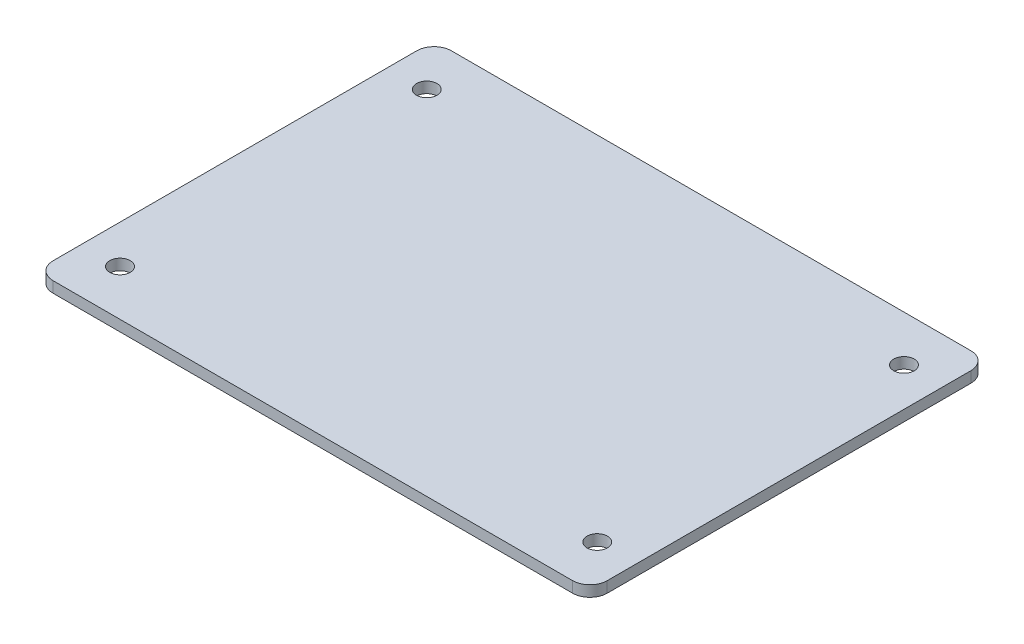
ISO-10303-21;
HEADER;
FILE_DESCRIPTION(('STEP AP214'),'2;1');
FILE_NAME('part.step','',(''),(''),'','','');
FILE_SCHEMA(('AUTOMOTIVE_DESIGN { 1 0 10303 214 1 1 1 1 }'));
ENDSEC;
DATA;
#1=APPLICATION_CONTEXT('core data for automotive mechanical design processes');
#2=APPLICATION_PROTOCOL_DEFINITION('international standard','automotive_design',2000,#1);
#3=PRODUCT_CONTEXT('',#1,'mechanical');
#4=PRODUCT('Part','Part','',(#3));
#5=PRODUCT_RELATED_PRODUCT_CATEGORY('part','',(#4));
#6=PRODUCT_DEFINITION_FORMATION('','',#4);
#7=PRODUCT_DEFINITION_CONTEXT('part definition',#1,'design');
#8=PRODUCT_DEFINITION('design','',#6,#7);
#9=PRODUCT_DEFINITION_SHAPE('','',#8);
#10=(LENGTH_UNIT() NAMED_UNIT(*) SI_UNIT(.MILLI.,.METRE.));
#11=(NAMED_UNIT(*) PLANE_ANGLE_UNIT() SI_UNIT($,.RADIAN.));
#12=(NAMED_UNIT(*) SI_UNIT($,.STERADIAN.) SOLID_ANGLE_UNIT());
#13=UNCERTAINTY_MEASURE_WITH_UNIT(LENGTH_MEASURE(1.E-05),#10,'distance_accuracy_value','');
#14=(GEOMETRIC_REPRESENTATION_CONTEXT(3) GLOBAL_UNCERTAINTY_ASSIGNED_CONTEXT((#13)) GLOBAL_UNIT_ASSIGNED_CONTEXT((#10,
#11,#12)) REPRESENTATION_CONTEXT('',''));
#15=CARTESIAN_POINT('',(0.,0.,0.));
#16=DIRECTION('',(0.,0.,1.));
#17=DIRECTION('',(1.,0.,0.));
#18=AXIS2_PLACEMENT_3D('',#15,#16,#17);
#19=CARTESIAN_POINT('',(38.1,1.6,-26.67));
#20=DIRECTION('',(0.,1.,0.));
#21=DIRECTION('',(0.,0.,1.));
#22=AXIS2_PLACEMENT_3D('',#19,#20,#21);
#23=PLANE('',#22);
#24=CARTESIAN_POINT('',(35.,1.6,22.5));
#25=DIRECTION('',(0.,1.,0.));
#26=DIRECTION('',(0.,0.,1.));
#27=AXIS2_PLACEMENT_3D('',#24,#25,#26);
#28=CIRCLE('',#27,1.5);
#29=CARTESIAN_POINT('',(35.,1.6,24.));
#30=VERTEX_POINT('',#29);
#31=EDGE_CURVE('E190',#30,#30,#28,.T.);
#32=ORIENTED_EDGE('',*,*,#31,.F.);
#33=EDGE_LOOP('',(#32));
#34=FACE_BOUND('',#33,.T.);
#35=CARTESIAN_POINT('',(-35.,1.6,-22.5));
#36=DIRECTION('',(0.,1.,0.));
#37=DIRECTION('',(0.,0.,1.));
#38=AXIS2_PLACEMENT_3D('',#35,#36,#37);
#39=CIRCLE('',#38,1.5);
#40=CARTESIAN_POINT('',(-35.,1.6,-21.));
#41=VERTEX_POINT('',#40);
#42=EDGE_CURVE('E136',#41,#41,#39,.T.);
#43=ORIENTED_EDGE('',*,*,#42,.F.);
#44=EDGE_LOOP('',(#43));
#45=FACE_BOUND('',#44,.T.);
#46=CARTESIAN_POINT('',(38.1,1.6,-26.67));
#47=DIRECTION('',(0.,1.,0.));
#48=DIRECTION('',(0.,0.,1.));
#49=AXIS2_PLACEMENT_3D('',#46,#47,#48);
#50=CIRCLE('',#49,2.54);
#51=CARTESIAN_POINT('',(40.64,1.6,-26.67));
#52=VERTEX_POINT('',#51);
#53=CARTESIAN_POINT('',(38.1,1.6,-29.21));
#54=VERTEX_POINT('',#53);
#55=EDGE_CURVE('E147',#52,#54,#50,.T.);
#56=ORIENTED_EDGE('',*,*,#55,.T.);
#57=DIRECTION('',(-1.,0.,0.));
#58=VECTOR('',#57,1.);
#59=CARTESIAN_POINT('',(38.1,1.6,-29.21));
#60=LINE('',#59,#58);
#61=CARTESIAN_POINT('',(-38.1,1.6,-29.21));
#62=VERTEX_POINT('',#61);
#63=EDGE_CURVE('E95',#54,#62,#60,.T.);
#64=ORIENTED_EDGE('',*,*,#63,.T.);
#65=CARTESIAN_POINT('',(-38.1,1.6,-26.67));
#66=DIRECTION('',(0.,1.,0.));
#67=DIRECTION('',(0.,0.,1.));
#68=AXIS2_PLACEMENT_3D('',#65,#66,#67);
#69=CIRCLE('',#68,2.54);
#70=CARTESIAN_POINT('',(-40.64,1.6,-26.67));
#71=VERTEX_POINT('',#70);
#72=EDGE_CURVE('E162',#62,#71,#69,.T.);
#73=ORIENTED_EDGE('',*,*,#72,.T.);
#74=DIRECTION('',(0.,0.,1.));
#75=VECTOR('',#74,1.);
#76=CARTESIAN_POINT('',(-40.64,1.6,26.67));
#77=LINE('',#76,#75);
#78=CARTESIAN_POINT('',(-40.64,1.6,26.67));
#79=VERTEX_POINT('',#78);
#80=EDGE_CURVE('E175',#71,#79,#77,.T.);
#81=ORIENTED_EDGE('',*,*,#80,.T.);
#82=CARTESIAN_POINT('',(-38.1,1.6,26.67));
#83=DIRECTION('',(0.,1.,0.));
#84=DIRECTION('',(0.,0.,-1.));
#85=AXIS2_PLACEMENT_3D('',#82,#83,#84);
#86=CIRCLE('',#85,2.54);
#87=CARTESIAN_POINT('',(-38.1,1.6,29.21));
#88=VERTEX_POINT('',#87);
#89=EDGE_CURVE('E114',#79,#88,#86,.T.);
#90=ORIENTED_EDGE('',*,*,#89,.T.);
#91=DIRECTION('',(1.,0.,0.));
#92=VECTOR('',#91,1.);
#93=CARTESIAN_POINT('',(38.1,1.6,29.21));
#94=LINE('',#93,#92);
#95=CARTESIAN_POINT('',(38.1,1.6,29.21));
#96=VERTEX_POINT('',#95);
#97=EDGE_CURVE('E108',#88,#96,#94,.T.);
#98=ORIENTED_EDGE('',*,*,#97,.T.);
#99=CARTESIAN_POINT('',(38.1,1.6,26.67));
#100=DIRECTION('',(0.,1.,0.));
#101=DIRECTION('',(0.,0.,1.));
#102=AXIS2_PLACEMENT_3D('',#99,#100,#101);
#103=CIRCLE('',#102,2.54);
#104=CARTESIAN_POINT('',(40.64,1.6,26.67));
#105=VERTEX_POINT('',#104);
#106=EDGE_CURVE('E112',#96,#105,#103,.T.);
#107=ORIENTED_EDGE('',*,*,#106,.T.);
#108=DIRECTION('',(0.,0.,-1.));
#109=VECTOR('',#108,1.);
#110=CARTESIAN_POINT('',(40.64,1.6,26.67));
#111=LINE('',#110,#109);
#112=EDGE_CURVE('E52',#105,#52,#111,.T.);
#113=ORIENTED_EDGE('',*,*,#112,.T.);
#114=EDGE_LOOP('',(#56,#64,#73,#81,#90,#98,#107,#113));
#115=FACE_BOUND('',#114,.T.);
#116=CARTESIAN_POINT('',(35.,1.6,-22.5));
#117=DIRECTION('',(0.,1.,0.));
#118=DIRECTION('',(0.,0.,1.));
#119=AXIS2_PLACEMENT_3D('',#116,#117,#118);
#120=CIRCLE('',#119,1.5);
#121=CARTESIAN_POINT('',(35.,1.6,-21.));
#122=VERTEX_POINT('',#121);
#123=EDGE_CURVE('E184',#122,#122,#120,.T.);
#124=ORIENTED_EDGE('',*,*,#123,.F.);
#125=EDGE_LOOP('',(#124));
#126=FACE_BOUND('',#125,.T.);
#127=CARTESIAN_POINT('',(-35.,1.6,22.5));
#128=DIRECTION('',(0.,1.,0.));
#129=DIRECTION('',(0.,0.,1.));
#130=AXIS2_PLACEMENT_3D('',#127,#128,#129);
#131=CIRCLE('',#130,1.5);
#132=CARTESIAN_POINT('',(-35.,1.6,24.));
#133=VERTEX_POINT('',#132);
#134=EDGE_CURVE('E196',#133,#133,#131,.T.);
#135=ORIENTED_EDGE('',*,*,#134,.F.);
#136=EDGE_LOOP('',(#135));
#137=FACE_BOUND('',#136,.T.);
#138=ADVANCED_FACE('F35',(#34,#45,#115,#126,#137),#23,.T.);
#139=CARTESIAN_POINT('',(38.1,0.,-26.67));
#140=DIRECTION('',(0.,1.,0.));
#141=DIRECTION('',(0.,0.,1.));
#142=AXIS2_PLACEMENT_3D('',#139,#140,#141);
#143=PLANE('',#142);
#144=CARTESIAN_POINT('',(38.1,0.,-26.67));
#145=DIRECTION('',(0.,1.,0.));
#146=DIRECTION('',(0.,0.,1.));
#147=AXIS2_PLACEMENT_3D('',#144,#145,#146);
#148=CIRCLE('',#147,2.54);
#149=CARTESIAN_POINT('',(40.64,0.,-26.67));
#150=VERTEX_POINT('',#149);
#151=CARTESIAN_POINT('',(38.1,0.,-29.21));
#152=VERTEX_POINT('',#151);
#153=EDGE_CURVE('E132',#150,#152,#148,.T.);
#154=ORIENTED_EDGE('',*,*,#153,.F.);
#155=DIRECTION('',(0.,0.,-1.));
#156=VECTOR('',#155,1.);
#157=CARTESIAN_POINT('',(40.64,0.,26.67));
#158=LINE('',#157,#156);
#159=CARTESIAN_POINT('',(40.64,0.,26.67));
#160=VERTEX_POINT('',#159);
#161=EDGE_CURVE('E87',#160,#150,#158,.T.);
#162=ORIENTED_EDGE('',*,*,#161,.F.);
#163=CARTESIAN_POINT('',(38.1,0.,26.67));
#164=DIRECTION('',(0.,1.,0.));
#165=DIRECTION('',(0.,0.,1.));
#166=AXIS2_PLACEMENT_3D('',#163,#164,#165);
#167=CIRCLE('',#166,2.54);
#168=CARTESIAN_POINT('',(38.1,0.,29.21));
#169=VERTEX_POINT('',#168);
#170=EDGE_CURVE('E81',#169,#160,#167,.T.);
#171=ORIENTED_EDGE('',*,*,#170,.F.);
#172=DIRECTION('',(1.,0.,0.));
#173=VECTOR('',#172,1.);
#174=CARTESIAN_POINT('',(38.1,0.,29.21));
#175=LINE('',#174,#173);
#176=CARTESIAN_POINT('',(-38.1,0.,29.21));
#177=VERTEX_POINT('',#176);
#178=EDGE_CURVE('E122',#177,#169,#175,.T.);
#179=ORIENTED_EDGE('',*,*,#178,.F.);
#180=CARTESIAN_POINT('',(-38.1,0.,26.67));
#181=DIRECTION('',(0.,1.,0.));
#182=DIRECTION('',(0.,0.,-1.));
#183=AXIS2_PLACEMENT_3D('',#180,#181,#182);
#184=CIRCLE('',#183,2.54);
#185=CARTESIAN_POINT('',(-40.64,0.,26.67));
#186=VERTEX_POINT('',#185);
#187=EDGE_CURVE('E142',#186,#177,#184,.T.);
#188=ORIENTED_EDGE('',*,*,#187,.F.);
#189=DIRECTION('',(0.,0.,1.));
#190=VECTOR('',#189,1.);
#191=CARTESIAN_POINT('',(-40.64,0.,26.67));
#192=LINE('',#191,#190);
#193=CARTESIAN_POINT('',(-40.64,0.,-26.67));
#194=VERTEX_POINT('',#193);
#195=EDGE_CURVE('E140',#194,#186,#192,.T.);
#196=ORIENTED_EDGE('',*,*,#195,.F.);
#197=CARTESIAN_POINT('',(-38.1,0.,-26.67));
#198=DIRECTION('',(0.,1.,0.));
#199=DIRECTION('',(0.,0.,1.));
#200=AXIS2_PLACEMENT_3D('',#197,#198,#199);
#201=CIRCLE('',#200,2.54);
#202=CARTESIAN_POINT('',(-38.1,0.,-29.21));
#203=VERTEX_POINT('',#202);
#204=EDGE_CURVE('E138',#203,#194,#201,.T.);
#205=ORIENTED_EDGE('',*,*,#204,.F.);
#206=DIRECTION('',(-1.,0.,0.));
#207=VECTOR('',#206,1.);
#208=CARTESIAN_POINT('',(38.1,0.,-29.21));
#209=LINE('',#208,#207);
#210=EDGE_CURVE('E135',#152,#203,#209,.T.);
#211=ORIENTED_EDGE('',*,*,#210,.F.);
#212=EDGE_LOOP('',(#154,#162,#171,#179,#188,#196,#205,#211));
#213=FACE_BOUND('',#212,.T.);
#214=CARTESIAN_POINT('',(-35.,0.,-22.5));
#215=DIRECTION('',(0.,1.,0.));
#216=DIRECTION('',(0.,0.,1.));
#217=AXIS2_PLACEMENT_3D('',#214,#215,#216);
#218=CIRCLE('',#217,1.5);
#219=CARTESIAN_POINT('',(-35.,0.,-21.));
#220=VERTEX_POINT('',#219);
#221=EDGE_CURVE('E181',#220,#220,#218,.T.);
#222=ORIENTED_EDGE('',*,*,#221,.T.);
#223=EDGE_LOOP('',(#222));
#224=FACE_BOUND('',#223,.T.);
#225=CARTESIAN_POINT('',(35.,0.,-22.5));
#226=DIRECTION('',(0.,1.,0.));
#227=DIRECTION('',(0.,0.,1.));
#228=AXIS2_PLACEMENT_3D('',#225,#226,#227);
#229=CIRCLE('',#228,1.5);
#230=CARTESIAN_POINT('',(35.,0.,-21.));
#231=VERTEX_POINT('',#230);
#232=EDGE_CURVE('E187',#231,#231,#229,.T.);
#233=ORIENTED_EDGE('',*,*,#232,.T.);
#234=EDGE_LOOP('',(#233));
#235=FACE_BOUND('',#234,.T.);
#236=CARTESIAN_POINT('',(35.,0.,22.5));
#237=DIRECTION('',(0.,1.,0.));
#238=DIRECTION('',(0.,0.,1.));
#239=AXIS2_PLACEMENT_3D('',#236,#237,#238);
#240=CIRCLE('',#239,1.5);
#241=CARTESIAN_POINT('',(35.,0.,24.));
#242=VERTEX_POINT('',#241);
#243=EDGE_CURVE('E193',#242,#242,#240,.T.);
#244=ORIENTED_EDGE('',*,*,#243,.T.);
#245=EDGE_LOOP('',(#244));
#246=FACE_BOUND('',#245,.T.);
#247=CARTESIAN_POINT('',(-35.,0.,22.5));
#248=DIRECTION('',(0.,1.,0.));
#249=DIRECTION('',(0.,0.,1.));
#250=AXIS2_PLACEMENT_3D('',#247,#248,#249);
#251=CIRCLE('',#250,1.5);
#252=CARTESIAN_POINT('',(-35.,0.,24.));
#253=VERTEX_POINT('',#252);
#254=EDGE_CURVE('E199',#253,#253,#251,.T.);
#255=ORIENTED_EDGE('',*,*,#254,.T.);
#256=EDGE_LOOP('',(#255));
#257=FACE_BOUND('',#256,.T.);
#258=ADVANCED_FACE('F166',(#213,#224,#235,#246,#257),#143,.F.);
#259=CARTESIAN_POINT('',(38.1,1.6,-26.67));
#260=DIRECTION('',(0.,-1.,0.));
#261=DIRECTION('',(0.,0.,-1.));
#262=AXIS2_PLACEMENT_3D('',#259,#260,#261);
#263=CYLINDRICAL_SURFACE('',#262,2.54);
#264=ORIENTED_EDGE('',*,*,#153,.T.);
#265=DIRECTION('',(0.,-1.,0.));
#266=VECTOR('',#265,1.);
#267=CARTESIAN_POINT('',(38.1,1.6,-29.21));
#268=LINE('',#267,#266);
#269=EDGE_CURVE('E11',#54,#152,#268,.T.);
#270=ORIENTED_EDGE('',*,*,#269,.F.);
#271=ORIENTED_EDGE('',*,*,#55,.F.);
#272=DIRECTION('',(0.,-1.,0.));
#273=VECTOR('',#272,1.);
#274=CARTESIAN_POINT('',(40.64,1.6,-26.67));
#275=LINE('',#274,#273);
#276=EDGE_CURVE('E128',#52,#150,#275,.T.);
#277=ORIENTED_EDGE('',*,*,#276,.T.);
#278=EDGE_LOOP('',(#264,#270,#271,#277));
#279=FACE_BOUND('',#278,.T.);
#280=ADVANCED_FACE('F37',(#279),#263,.T.);
#281=CARTESIAN_POINT('',(38.1,1.6,-29.21));
#282=DIRECTION('',(0.,0.,1.));
#283=DIRECTION('',(1.,0.,0.));
#284=AXIS2_PLACEMENT_3D('',#281,#282,#283);
#285=PLANE('',#284);
#286=ORIENTED_EDGE('',*,*,#210,.T.);
#287=DIRECTION('',(0.,-1.,0.));
#288=VECTOR('',#287,1.);
#289=CARTESIAN_POINT('',(-38.1,1.6,-29.21));
#290=LINE('',#289,#288);
#291=EDGE_CURVE('E44',#62,#203,#290,.T.);
#292=ORIENTED_EDGE('',*,*,#291,.F.);
#293=ORIENTED_EDGE('',*,*,#63,.F.);
#294=ORIENTED_EDGE('',*,*,#269,.T.);
#295=EDGE_LOOP('',(#286,#292,#293,#294));
#296=FACE_BOUND('',#295,.T.);
#297=ADVANCED_FACE('F233',(#296),#285,.F.);
#298=CARTESIAN_POINT('',(-38.1,1.6,-26.67));
#299=DIRECTION('',(0.,-1.,0.));
#300=DIRECTION('',(0.,0.,-1.));
#301=AXIS2_PLACEMENT_3D('',#298,#299,#300);
#302=CYLINDRICAL_SURFACE('',#301,2.54);
#303=ORIENTED_EDGE('',*,*,#204,.T.);
#304=DIRECTION('',(0.,-1.,0.));
#305=VECTOR('',#304,1.);
#306=CARTESIAN_POINT('',(-40.64,1.6,-26.67));
#307=LINE('',#306,#305);
#308=EDGE_CURVE('E154',#71,#194,#307,.T.);
#309=ORIENTED_EDGE('',*,*,#308,.F.);
#310=ORIENTED_EDGE('',*,*,#72,.F.);
#311=ORIENTED_EDGE('',*,*,#291,.T.);
#312=EDGE_LOOP('',(#303,#309,#310,#311));
#313=FACE_BOUND('',#312,.T.);
#314=ADVANCED_FACE('F160',(#313),#302,.T.);
#315=CARTESIAN_POINT('',(-40.64,1.6,26.67));
#316=DIRECTION('',(1.,0.,0.));
#317=DIRECTION('',(0.,0.,-1.));
#318=AXIS2_PLACEMENT_3D('',#315,#316,#317);
#319=PLANE('',#318);
#320=ORIENTED_EDGE('',*,*,#195,.T.);
#321=DIRECTION('',(0.,-1.,0.));
#322=VECTOR('',#321,1.);
#323=CARTESIAN_POINT('',(-40.64,1.6,26.67));
#324=LINE('',#323,#322);
#325=EDGE_CURVE('E151',#79,#186,#324,.T.);
#326=ORIENTED_EDGE('',*,*,#325,.F.);
#327=ORIENTED_EDGE('',*,*,#80,.F.);
#328=ORIENTED_EDGE('',*,*,#308,.T.);
#329=EDGE_LOOP('',(#320,#326,#327,#328));
#330=FACE_BOUND('',#329,.T.);
#331=ADVANCED_FACE('F171',(#330),#319,.F.);
#332=CARTESIAN_POINT('',(-38.1,1.6,26.67));
#333=DIRECTION('',(0.,-1.,0.));
#334=DIRECTION('',(0.,0.,-1.));
#335=AXIS2_PLACEMENT_3D('',#332,#333,#334);
#336=CYLINDRICAL_SURFACE('',#335,2.54);
#337=ORIENTED_EDGE('',*,*,#187,.T.);
#338=DIRECTION('',(0.,-1.,0.));
#339=VECTOR('',#338,1.);
#340=CARTESIAN_POINT('',(-38.1,1.6,29.21));
#341=LINE('',#340,#339);
#342=EDGE_CURVE('E123',#88,#177,#341,.T.);
#343=ORIENTED_EDGE('',*,*,#342,.F.);
#344=ORIENTED_EDGE('',*,*,#89,.F.);
#345=ORIENTED_EDGE('',*,*,#325,.T.);
#346=EDGE_LOOP('',(#337,#343,#344,#345));
#347=FACE_BOUND('',#346,.T.);
#348=ADVANCED_FACE('F174',(#347),#336,.T.);
#349=CARTESIAN_POINT('',(38.1,1.6,29.21));
#350=DIRECTION('',(0.,0.,-1.));
#351=DIRECTION('',(-1.,0.,0.));
#352=AXIS2_PLACEMENT_3D('',#349,#350,#351);
#353=PLANE('',#352);
#354=ORIENTED_EDGE('',*,*,#178,.T.);
#355=DIRECTION('',(0.,-1.,0.));
#356=VECTOR('',#355,1.);
#357=CARTESIAN_POINT('',(38.1,1.6,29.21));
#358=LINE('',#357,#356);
#359=EDGE_CURVE('E119',#96,#169,#358,.T.);
#360=ORIENTED_EDGE('',*,*,#359,.F.);
#361=ORIENTED_EDGE('',*,*,#97,.F.);
#362=ORIENTED_EDGE('',*,*,#342,.T.);
#363=EDGE_LOOP('',(#354,#360,#361,#362));
#364=FACE_BOUND('',#363,.T.);
#365=ADVANCED_FACE('F120',(#364),#353,.F.);
#366=CARTESIAN_POINT('',(38.1,1.6,26.67));
#367=DIRECTION('',(0.,-1.,0.));
#368=DIRECTION('',(0.,0.,-1.));
#369=AXIS2_PLACEMENT_3D('',#366,#367,#368);
#370=CYLINDRICAL_SURFACE('',#369,2.54);
#371=ORIENTED_EDGE('',*,*,#170,.T.);
#372=DIRECTION('',(0.,-1.,0.));
#373=VECTOR('',#372,1.);
#374=CARTESIAN_POINT('',(40.64,1.6,26.67));
#375=LINE('',#374,#373);
#376=EDGE_CURVE('E124',#105,#160,#375,.T.);
#377=ORIENTED_EDGE('',*,*,#376,.F.);
#378=ORIENTED_EDGE('',*,*,#106,.F.);
#379=ORIENTED_EDGE('',*,*,#359,.T.);
#380=EDGE_LOOP('',(#371,#377,#378,#379));
#381=FACE_BOUND('',#380,.T.);
#382=ADVANCED_FACE('F126',(#381),#370,.T.);
#383=CARTESIAN_POINT('',(40.64,1.6,26.67));
#384=DIRECTION('',(-1.,0.,0.));
#385=DIRECTION('',(0.,0.,1.));
#386=AXIS2_PLACEMENT_3D('',#383,#384,#385);
#387=PLANE('',#386);
#388=ORIENTED_EDGE('',*,*,#161,.T.);
#389=ORIENTED_EDGE('',*,*,#276,.F.);
#390=ORIENTED_EDGE('',*,*,#112,.F.);
#391=ORIENTED_EDGE('',*,*,#376,.T.);
#392=EDGE_LOOP('',(#388,#389,#390,#391));
#393=FACE_BOUND('',#392,.T.);
#394=ADVANCED_FACE('F221',(#393),#387,.F.);
#395=CARTESIAN_POINT('',(-35.,1.6,-22.5));
#396=DIRECTION('',(0.,-1.,0.));
#397=DIRECTION('',(0.,0.,-1.));
#398=AXIS2_PLACEMENT_3D('',#395,#396,#397);
#399=CYLINDRICAL_SURFACE('',#398,1.5);
#400=ORIENTED_EDGE('',*,*,#42,.T.);
#401=EDGE_LOOP('',(#400));
#402=FACE_BOUND('',#401,.T.);
#403=ORIENTED_EDGE('',*,*,#221,.F.);
#404=EDGE_LOOP('',(#403));
#405=FACE_BOUND('',#404,.T.);
#406=ADVANCED_FACE('F218',(#402,#405),#399,.F.);
#407=CARTESIAN_POINT('',(35.,1.6,-22.5));
#408=DIRECTION('',(0.,-1.,0.));
#409=DIRECTION('',(0.,0.,-1.));
#410=AXIS2_PLACEMENT_3D('',#407,#408,#409);
#411=CYLINDRICAL_SURFACE('',#410,1.5);
#412=ORIENTED_EDGE('',*,*,#123,.T.);
#413=EDGE_LOOP('',(#412));
#414=FACE_BOUND('',#413,.T.);
#415=ORIENTED_EDGE('',*,*,#232,.F.);
#416=EDGE_LOOP('',(#415));
#417=FACE_BOUND('',#416,.T.);
#418=ADVANCED_FACE('F297',(#414,#417),#411,.F.);
#419=CARTESIAN_POINT('',(35.,1.6,22.5));
#420=DIRECTION('',(0.,-1.,0.));
#421=DIRECTION('',(0.,0.,-1.));
#422=AXIS2_PLACEMENT_3D('',#419,#420,#421);
#423=CYLINDRICAL_SURFACE('',#422,1.5);
#424=ORIENTED_EDGE('',*,*,#31,.T.);
#425=EDGE_LOOP('',(#424));
#426=FACE_BOUND('',#425,.T.);
#427=ORIENTED_EDGE('',*,*,#243,.F.);
#428=EDGE_LOOP('',(#427));
#429=FACE_BOUND('',#428,.T.);
#430=ADVANCED_FACE('F305',(#426,#429),#423,.F.);
#431=CARTESIAN_POINT('',(-35.,1.6,22.5));
#432=DIRECTION('',(0.,-1.,0.));
#433=DIRECTION('',(0.,0.,-1.));
#434=AXIS2_PLACEMENT_3D('',#431,#432,#433);
#435=CYLINDRICAL_SURFACE('',#434,1.5);
#436=ORIENTED_EDGE('',*,*,#134,.T.);
#437=EDGE_LOOP('',(#436));
#438=FACE_BOUND('',#437,.T.);
#439=ORIENTED_EDGE('',*,*,#254,.F.);
#440=EDGE_LOOP('',(#439));
#441=FACE_BOUND('',#440,.T.);
#442=ADVANCED_FACE('F205',(#438,#441),#435,.F.);
#443=CLOSED_SHELL('',(#138,#258,#280,#297,#314,#331,#348,#365,#382,#394,#406,#418,#430,#442));
#444=MANIFOLD_SOLID_BREP('B2',#443);
#445=ADVANCED_BREP_SHAPE_REPRESENTATION('',(#18,#444),#14);
#446=SHAPE_DEFINITION_REPRESENTATION(#9,#445);
ENDSEC;
END-ISO-10303-21;
